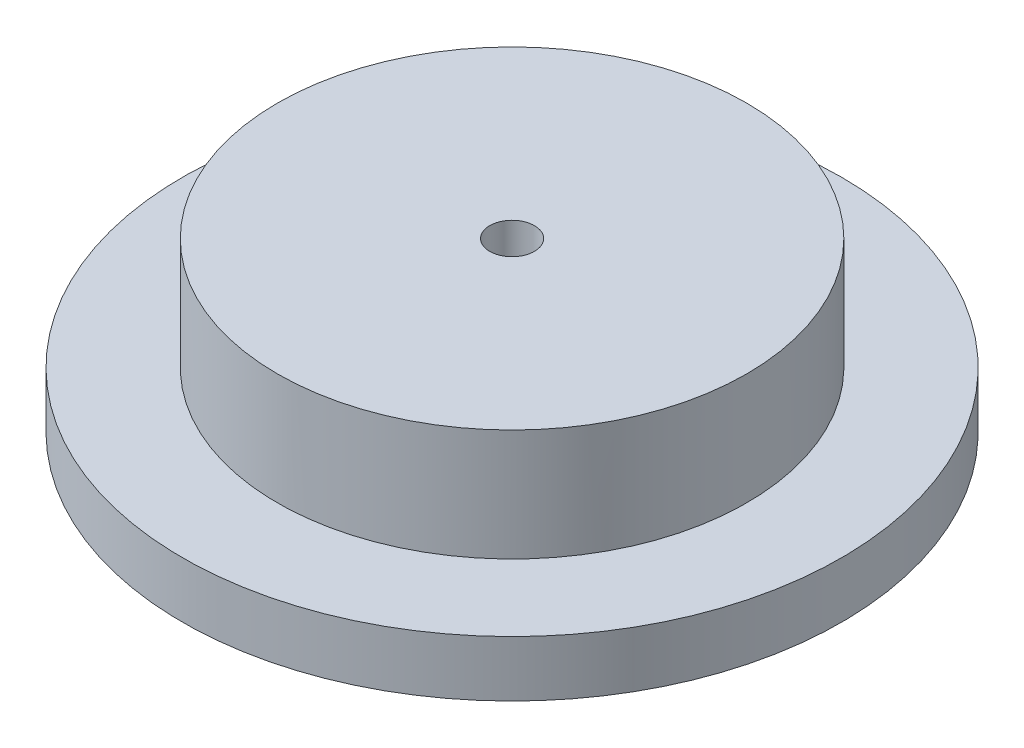
ISO-10303-21;
HEADER;
FILE_DESCRIPTION(('STEP AP214'),'2;1');
FILE_NAME('part.step','',(''),(''),'','','');
FILE_SCHEMA(('AUTOMOTIVE_DESIGN { 1 0 10303 214 1 1 1 1 }'));
ENDSEC;
DATA;
#1=APPLICATION_CONTEXT('core data for automotive mechanical design processes');
#2=APPLICATION_PROTOCOL_DEFINITION('international standard','automotive_design',2000,#1);
#3=PRODUCT_CONTEXT('',#1,'mechanical');
#4=PRODUCT('Part','Part','',(#3));
#5=PRODUCT_RELATED_PRODUCT_CATEGORY('part','',(#4));
#6=PRODUCT_DEFINITION_FORMATION('','',#4);
#7=PRODUCT_DEFINITION_CONTEXT('part definition',#1,'design');
#8=PRODUCT_DEFINITION('design','',#6,#7);
#9=PRODUCT_DEFINITION_SHAPE('','',#8);
#10=(LENGTH_UNIT() NAMED_UNIT(*) SI_UNIT(.MILLI.,.METRE.));
#11=(NAMED_UNIT(*) PLANE_ANGLE_UNIT() SI_UNIT($,.RADIAN.));
#12=(NAMED_UNIT(*) SI_UNIT($,.STERADIAN.) SOLID_ANGLE_UNIT());
#13=UNCERTAINTY_MEASURE_WITH_UNIT(LENGTH_MEASURE(1.E-05),#10,'distance_accuracy_value','');
#14=(GEOMETRIC_REPRESENTATION_CONTEXT(3) GLOBAL_UNCERTAINTY_ASSIGNED_CONTEXT((#13)) GLOBAL_UNIT_ASSIGNED_CONTEXT((#10,
#11,#12)) REPRESENTATION_CONTEXT('',''));
#15=CARTESIAN_POINT('',(0.,0.,0.));
#16=DIRECTION('',(0.,0.,1.));
#17=DIRECTION('',(1.,0.,0.));
#18=AXIS2_PLACEMENT_3D('',#15,#16,#17);
#19=CARTESIAN_POINT('',(0.,1.,0.));
#20=DIRECTION('',(0.,-1.,0.));
#21=DIRECTION('',(0.,0.,-1.));
#22=AXIS2_PLACEMENT_3D('',#19,#20,#21);
#23=CYLINDRICAL_SURFACE('',#22,2.1);
#24=CARTESIAN_POINT('',(0.,1.,0.));
#25=DIRECTION('',(0.,1.,0.));
#26=DIRECTION('',(0.,0.,1.));
#27=AXIS2_PLACEMENT_3D('',#24,#25,#26);
#28=CIRCLE('',#27,2.1);
#29=CARTESIAN_POINT('',(0.,1.,2.1));
#30=VERTEX_POINT('',#29);
#31=EDGE_CURVE('E10',#30,#30,#28,.T.);
#32=ORIENTED_EDGE('',*,*,#31,.F.);
#33=EDGE_LOOP('',(#32));
#34=FACE_BOUND('',#33,.T.);
#35=CARTESIAN_POINT('',(0.,0.,0.));
#36=DIRECTION('',(0.,-1.,0.));
#37=DIRECTION('',(0.,0.,-1.));
#38=AXIS2_PLACEMENT_3D('',#35,#36,#37);
#39=CIRCLE('',#38,2.1);
#40=CARTESIAN_POINT('',(0.,0.,-2.1));
#41=VERTEX_POINT('',#40);
#42=EDGE_CURVE('E37',#41,#41,#39,.T.);
#43=ORIENTED_EDGE('',*,*,#42,.F.);
#44=EDGE_LOOP('',(#43));
#45=FACE_BOUND('',#44,.T.);
#46=ADVANCED_FACE('F31',(#34,#45),#23,.T.);
#47=CARTESIAN_POINT('',(0.,1.,0.));
#48=DIRECTION('',(0.,1.,0.));
#49=DIRECTION('',(0.,0.,1.));
#50=AXIS2_PLACEMENT_3D('',#47,#48,#49);
#51=PLANE('',#50);
#52=CARTESIAN_POINT('',(0.,1.,0.));
#53=DIRECTION('',(0.,1.,0.));
#54=DIRECTION('',(0.,0.,1.));
#55=AXIS2_PLACEMENT_3D('',#52,#53,#54);
#56=CIRCLE('',#55,0.2);
#57=CARTESIAN_POINT('',(0.,1.,0.2));
#58=VERTEX_POINT('',#57);
#59=EDGE_CURVE('E51',#58,#58,#56,.T.);
#60=ORIENTED_EDGE('',*,*,#59,.F.);
#61=EDGE_LOOP('',(#60));
#62=FACE_BOUND('',#61,.T.);
#63=ORIENTED_EDGE('',*,*,#31,.T.);
#64=EDGE_LOOP('',(#63));
#65=FACE_BOUND('',#64,.T.);
#66=ADVANCED_FACE('F66',(#62,#65),#51,.T.);
#67=CARTESIAN_POINT('',(0.,0.,0.));
#68=DIRECTION('',(0.,-1.,0.));
#69=DIRECTION('',(0.,0.,-1.));
#70=AXIS2_PLACEMENT_3D('',#67,#68,#69);
#71=PLANE('',#70);
#72=CARTESIAN_POINT('',(0.,0.,0.));
#73=DIRECTION('',(0.,-1.,0.));
#74=DIRECTION('',(0.,0.,-1.));
#75=AXIS2_PLACEMENT_3D('',#72,#73,#74);
#76=CIRCLE('',#75,2.95);
#77=CARTESIAN_POINT('',(0.,0.,-2.95));
#78=VERTEX_POINT('',#77);
#79=EDGE_CURVE('E45',#78,#78,#76,.T.);
#80=ORIENTED_EDGE('',*,*,#79,.F.);
#81=EDGE_LOOP('',(#80));
#82=FACE_BOUND('',#81,.T.);
#83=ORIENTED_EDGE('',*,*,#42,.T.);
#84=EDGE_LOOP('',(#83));
#85=FACE_BOUND('',#84,.T.);
#86=ADVANCED_FACE('F68',(#82,#85),#71,.F.);
#87=CARTESIAN_POINT('',(0.,-0.5,0.));
#88=DIRECTION('',(0.,1.,0.));
#89=DIRECTION('',(0.,0.,1.));
#90=AXIS2_PLACEMENT_3D('',#87,#88,#89);
#91=CYLINDRICAL_SURFACE('',#90,2.95);
#92=CARTESIAN_POINT('',(0.,-0.5,0.));
#93=DIRECTION('',(0.,-1.,0.));
#94=DIRECTION('',(0.,0.,-1.));
#95=AXIS2_PLACEMENT_3D('',#92,#93,#94);
#96=CIRCLE('',#95,2.95);
#97=CARTESIAN_POINT('',(0.,-0.5,-2.95));
#98=VERTEX_POINT('',#97);
#99=EDGE_CURVE('E41',#98,#98,#96,.T.);
#100=ORIENTED_EDGE('',*,*,#99,.F.);
#101=EDGE_LOOP('',(#100));
#102=FACE_BOUND('',#101,.T.);
#103=ORIENTED_EDGE('',*,*,#79,.T.);
#104=EDGE_LOOP('',(#103));
#105=FACE_BOUND('',#104,.T.);
#106=ADVANCED_FACE('F73',(#102,#105),#91,.T.);
#107=CARTESIAN_POINT('',(0.,-0.5,0.));
#108=DIRECTION('',(0.,-1.,0.));
#109=DIRECTION('',(0.,0.,-1.));
#110=AXIS2_PLACEMENT_3D('',#107,#108,#109);
#111=PLANE('',#110);
#112=CARTESIAN_POINT('',(0.,-0.5,0.));
#113=DIRECTION('',(0.,1.,0.));
#114=DIRECTION('',(0.,0.,1.));
#115=AXIS2_PLACEMENT_3D('',#112,#113,#114);
#116=CIRCLE('',#115,0.2);
#117=CARTESIAN_POINT('',(0.,-0.5,0.2));
#118=VERTEX_POINT('',#117);
#119=EDGE_CURVE('E49',#118,#118,#116,.T.);
#120=ORIENTED_EDGE('',*,*,#119,.T.);
#121=EDGE_LOOP('',(#120));
#122=FACE_BOUND('',#121,.T.);
#123=ORIENTED_EDGE('',*,*,#99,.T.);
#124=EDGE_LOOP('',(#123));
#125=FACE_BOUND('',#124,.T.);
#126=ADVANCED_FACE('F57',(#122,#125),#111,.T.);
#127=CARTESIAN_POINT('',(0.,-0.5,0.));
#128=DIRECTION('',(0.,1.,0.));
#129=DIRECTION('',(0.,0.,1.));
#130=AXIS2_PLACEMENT_3D('',#127,#128,#129);
#131=CYLINDRICAL_SURFACE('',#130,0.2);
#132=ORIENTED_EDGE('',*,*,#119,.F.);
#133=EDGE_LOOP('',(#132));
#134=FACE_BOUND('',#133,.T.);
#135=ORIENTED_EDGE('',*,*,#59,.T.);
#136=EDGE_LOOP('',(#135));
#137=FACE_BOUND('',#136,.T.);
#138=ADVANCED_FACE('F60',(#134,#137),#131,.F.);
#139=CLOSED_SHELL('',(#46,#66,#86,#106,#126,#138));
#140=MANIFOLD_SOLID_BREP('B2',#139);
#141=ADVANCED_BREP_SHAPE_REPRESENTATION('',(#18,#140),#14);
#142=SHAPE_DEFINITION_REPRESENTATION(#9,#141);
ENDSEC;
END-ISO-10303-21;
